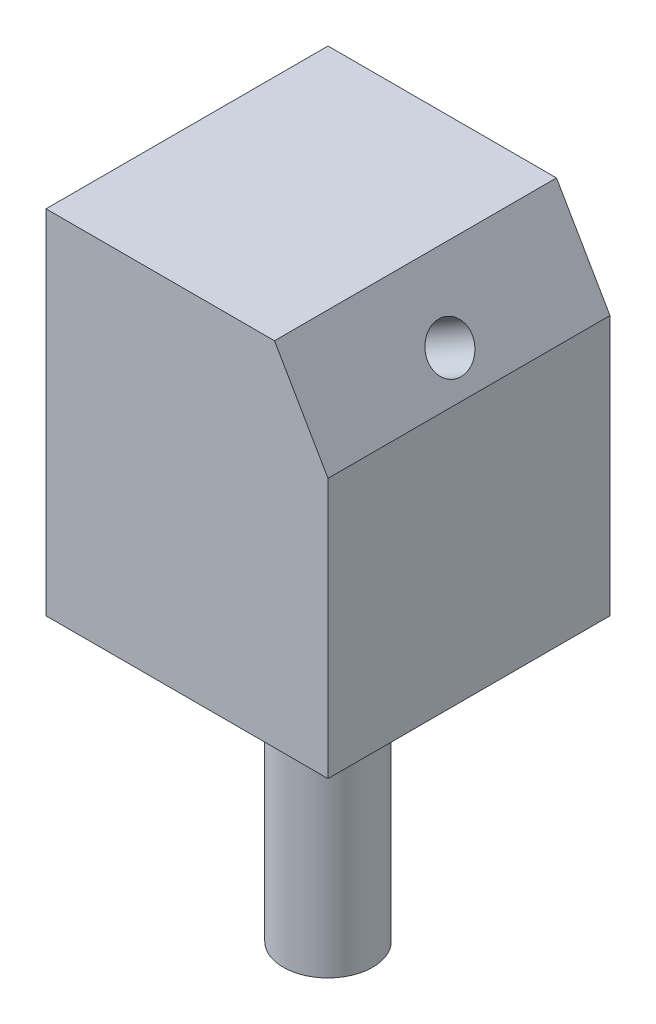
ISO-10303-21;
HEADER;
FILE_DESCRIPTION(('STEP AP214'),'2;1');
FILE_NAME('part.step','',(''),(''),'','','');
FILE_SCHEMA(('AUTOMOTIVE_DESIGN { 1 0 10303 214 1 1 1 1 }'));
ENDSEC;
DATA;
#1=APPLICATION_CONTEXT('core data for automotive mechanical design processes');
#2=APPLICATION_PROTOCOL_DEFINITION('international standard','automotive_design',2000,#1);
#3=PRODUCT_CONTEXT('',#1,'mechanical');
#4=PRODUCT('Part','Part','',(#3));
#5=PRODUCT_RELATED_PRODUCT_CATEGORY('part','',(#4));
#6=PRODUCT_DEFINITION_FORMATION('','',#4);
#7=PRODUCT_DEFINITION_CONTEXT('part definition',#1,'design');
#8=PRODUCT_DEFINITION('design','',#6,#7);
#9=PRODUCT_DEFINITION_SHAPE('','',#8);
#10=(LENGTH_UNIT() NAMED_UNIT(*) SI_UNIT(.MILLI.,.METRE.));
#11=(NAMED_UNIT(*) PLANE_ANGLE_UNIT() SI_UNIT($,.RADIAN.));
#12=(NAMED_UNIT(*) SI_UNIT($,.STERADIAN.) SOLID_ANGLE_UNIT());
#13=UNCERTAINTY_MEASURE_WITH_UNIT(LENGTH_MEASURE(1.E-05),#10,'distance_accuracy_value','');
#14=(GEOMETRIC_REPRESENTATION_CONTEXT(3) GLOBAL_UNCERTAINTY_ASSIGNED_CONTEXT((#13)) GLOBAL_UNIT_ASSIGNED_CONTEXT((#10,
#11,#12)) REPRESENTATION_CONTEXT('',''));
#15=CARTESIAN_POINT('',(0.,0.,0.));
#16=DIRECTION('',(0.,0.,1.));
#17=DIRECTION('',(1.,0.,0.));
#18=AXIS2_PLACEMENT_3D('',#15,#16,#17);
#19=CARTESIAN_POINT('',(13.859649122807,30.,5.70175438596492));
#20=DIRECTION('',(-1.,0.,0.));
#21=DIRECTION('',(0.,0.,1.));
#22=AXIS2_PLACEMENT_3D('',#19,#20,#21);
#23=PLANE('',#22);
#24=DIRECTION('',(0.,-1.,0.));
#25=VECTOR('',#24,1.);
#26=CARTESIAN_POINT('',(13.859649122807,30.,-14.2982456140351));
#27=LINE('',#26,#25);
#28=CARTESIAN_POINT('',(13.859649122807,18.4443493210276,-14.2982456140351));
#29=VERTEX_POINT('',#28);
#30=CARTESIAN_POINT('',(13.859649122807,0.,-14.2982456140351));
#31=VERTEX_POINT('',#30);
#32=EDGE_CURVE('E55',#29,#31,#27,.T.);
#33=ORIENTED_EDGE('',*,*,#32,.F.);
#34=DIRECTION('',(0.,0.,1.));
#35=VECTOR('',#34,1.);
#36=CARTESIAN_POINT('',(13.859649122807,18.4443493210276,-14.2982456140351));
#37=LINE('',#36,#35);
#38=CARTESIAN_POINT('',(13.859649122807,18.4443493210276,5.70175438596492));
#39=VERTEX_POINT('',#38);
#40=EDGE_CURVE('E117',#29,#39,#37,.T.);
#41=ORIENTED_EDGE('',*,*,#40,.T.);
#42=DIRECTION('',(0.,-1.,0.));
#43=VECTOR('',#42,1.);
#44=CARTESIAN_POINT('',(13.859649122807,30.,5.70175438596492));
#45=LINE('',#44,#43);
#46=CARTESIAN_POINT('',(13.859649122807,0.,5.70175438596492));
#47=VERTEX_POINT('',#46);
#48=EDGE_CURVE('E99',#39,#47,#45,.T.);
#49=ORIENTED_EDGE('',*,*,#48,.T.);
#50=DIRECTION('',(0.,0.,-1.));
#51=VECTOR('',#50,1.);
#52=CARTESIAN_POINT('',(13.859649122807,0.,5.70175438596492));
#53=LINE('',#52,#51);
#54=EDGE_CURVE('E101',#47,#31,#53,.T.);
#55=ORIENTED_EDGE('',*,*,#54,.T.);
#56=EDGE_LOOP('',(#33,#41,#49,#55));
#57=FACE_BOUND('',#56,.T.);
#58=ADVANCED_FACE('F32',(#57),#23,.F.);
#59=CARTESIAN_POINT('',(-6.14035087719298,30.,5.70175438596492));
#60=DIRECTION('',(1.,0.,0.));
#61=DIRECTION('',(0.,0.,-1.));
#62=AXIS2_PLACEMENT_3D('',#59,#60,#61);
#63=PLANE('',#62);
#64=CARTESIAN_POINT('',(-6.14035087719298,9.99252381273904,-4.29824561403508));
#65=DIRECTION('',(1.,0.,0.));
#66=DIRECTION('',(0.,1.,0.));
#67=AXIS2_PLACEMENT_3D('',#64,#65,#66);
#68=ELLIPSE('',#67,1.83423392498734,1.5875);
#69=CARTESIAN_POINT('',(-6.14035087719298,11.8267577377264,-4.29824561403508));
#70=VERTEX_POINT('',#69);
#71=EDGE_CURVE('E124',#70,#70,#68,.T.);
#72=ORIENTED_EDGE('',*,*,#71,.T.);
#73=EDGE_LOOP('',(#72));
#74=FACE_BOUND('',#73,.T.);
#75=DIRECTION('',(0.,-1.,0.));
#76=VECTOR('',#75,1.);
#77=CARTESIAN_POINT('',(-6.14035087719298,30.,5.70175438596492));
#78=LINE('',#77,#76);
#79=CARTESIAN_POINT('',(-6.14035087719298,25.,5.70175438596492));
#80=VERTEX_POINT('',#79);
#81=CARTESIAN_POINT('',(-6.14035087719298,0.,5.70175438596492));
#82=VERTEX_POINT('',#81);
#83=EDGE_CURVE('E36',#80,#82,#78,.T.);
#84=ORIENTED_EDGE('',*,*,#83,.F.);
#85=DIRECTION('',(0.,0.,1.));
#86=VECTOR('',#85,1.);
#87=CARTESIAN_POINT('',(-6.14035087719298,25.,-14.2982456140351));
#88=LINE('',#87,#86);
#89=CARTESIAN_POINT('',(-6.14035087719298,25.,-14.2982456140351));
#90=VERTEX_POINT('',#89);
#91=EDGE_CURVE('E86',#90,#80,#88,.T.);
#92=ORIENTED_EDGE('',*,*,#91,.F.);
#93=DIRECTION('',(0.,-1.,0.));
#94=VECTOR('',#93,1.);
#95=CARTESIAN_POINT('',(-6.14035087719298,30.,-14.2982456140351));
#96=LINE('',#95,#94);
#97=CARTESIAN_POINT('',(-6.14035087719298,0.,-14.2982456140351));
#98=VERTEX_POINT('',#97);
#99=EDGE_CURVE('E48',#90,#98,#96,.T.);
#100=ORIENTED_EDGE('',*,*,#99,.T.);
#101=DIRECTION('',(0.,0.,1.));
#102=VECTOR('',#101,1.);
#103=CARTESIAN_POINT('',(-6.14035087719298,0.,5.70175438596492));
#104=LINE('',#103,#102);
#105=EDGE_CURVE('E115',#98,#82,#104,.T.);
#106=ORIENTED_EDGE('',*,*,#105,.T.);
#107=EDGE_LOOP('',(#84,#92,#100,#106));
#108=FACE_BOUND('',#107,.T.);
#109=ADVANCED_FACE('F34',(#74,#108),#63,.F.);
#110=CARTESIAN_POINT('',(-6.14035087719298,30.,5.70175438596492));
#111=DIRECTION('',(0.,0.,-1.));
#112=DIRECTION('',(-1.,0.,0.));
#113=AXIS2_PLACEMENT_3D('',#110,#111,#112);
#114=PLANE('',#113);
#115=DIRECTION('',(0.500936676278387,-0.865483937666762,0.));
#116=VECTOR('',#115,1.);
#117=CARTESIAN_POINT('',(13.859649122807,18.4443493210276,5.70175438596492));
#118=LINE('',#117,#116);
#119=CARTESIAN_POINT('',(10.0652796157082,25.,5.70175438596492));
#120=VERTEX_POINT('',#119);
#121=EDGE_CURVE('E123',#120,#39,#118,.T.);
#122=ORIENTED_EDGE('',*,*,#121,.F.);
#123=DIRECTION('',(1.,0.,0.));
#124=VECTOR('',#123,1.);
#125=CARTESIAN_POINT('',(10.0652796157082,25.,5.70175438596492));
#126=LINE('',#125,#124);
#127=EDGE_CURVE('E90',#80,#120,#126,.T.);
#128=ORIENTED_EDGE('',*,*,#127,.F.);
#129=ORIENTED_EDGE('',*,*,#83,.T.);
#130=DIRECTION('',(1.,0.,0.));
#131=VECTOR('',#130,1.);
#132=CARTESIAN_POINT('',(-6.14035087719298,0.,5.70175438596492));
#133=LINE('',#132,#131);
#134=EDGE_CURVE('E111',#82,#47,#133,.T.);
#135=ORIENTED_EDGE('',*,*,#134,.T.);
#136=ORIENTED_EDGE('',*,*,#48,.F.);
#137=EDGE_LOOP('',(#122,#128,#129,#135,#136));
#138=FACE_BOUND('',#137,.T.);
#139=ADVANCED_FACE('F110',(#138),#114,.F.);
#140=CARTESIAN_POINT('',(-6.14035087719298,30.,-14.2982456140351));
#141=DIRECTION('',(0.,0.,1.));
#142=DIRECTION('',(1.,0.,0.));
#143=AXIS2_PLACEMENT_3D('',#140,#141,#142);
#144=PLANE('',#143);
#145=DIRECTION('',(1.,0.,0.));
#146=VECTOR('',#145,1.);
#147=CARTESIAN_POINT('',(10.0652796157082,25.,-14.2982456140351));
#148=LINE('',#147,#146);
#149=CARTESIAN_POINT('',(10.0652796157082,25.,-14.2982456140351));
#150=VERTEX_POINT('',#149);
#151=EDGE_CURVE('E83',#90,#150,#148,.T.);
#152=ORIENTED_EDGE('',*,*,#151,.T.);
#153=DIRECTION('',(0.500936676278387,-0.865483937666762,0.));
#154=VECTOR('',#153,1.);
#155=CARTESIAN_POINT('',(13.859649122807,18.4443493210276,-14.2982456140351));
#156=LINE('',#155,#154);
#157=EDGE_CURVE('E119',#150,#29,#156,.T.);
#158=ORIENTED_EDGE('',*,*,#157,.T.);
#159=ORIENTED_EDGE('',*,*,#32,.T.);
#160=DIRECTION('',(-1.,0.,0.));
#161=VECTOR('',#160,1.);
#162=CARTESIAN_POINT('',(-6.14035087719298,0.,-14.2982456140351));
#163=LINE('',#162,#161);
#164=EDGE_CURVE('E96',#31,#98,#163,.T.);
#165=ORIENTED_EDGE('',*,*,#164,.T.);
#166=ORIENTED_EDGE('',*,*,#99,.F.);
#167=EDGE_LOOP('',(#152,#158,#159,#165,#166));
#168=FACE_BOUND('',#167,.T.);
#169=ADVANCED_FACE('F94',(#168),#144,.F.);
#170=CARTESIAN_POINT('',(0.,0.,0.));
#171=DIRECTION('',(0.,-1.,0.));
#172=DIRECTION('',(0.,0.,-1.));
#173=AXIS2_PLACEMENT_3D('',#170,#171,#172);
#174=PLANE('',#173);
#175=CARTESIAN_POINT('',(3.85964912280702,0.,-4.29824561403508));
#176=DIRECTION('',(0.,-1.,0.));
#177=DIRECTION('',(0.,0.,-1.));
#178=AXIS2_PLACEMENT_3D('',#175,#176,#177);
#179=CIRCLE('',#178,3.175);
#180=CARTESIAN_POINT('',(3.85964912280702,0.,-7.47324561403508));
#181=VERTEX_POINT('',#180);
#182=EDGE_CURVE('E11',#181,#181,#179,.T.);
#183=ORIENTED_EDGE('',*,*,#182,.F.);
#184=EDGE_LOOP('',(#183));
#185=FACE_BOUND('',#184,.T.);
#186=ORIENTED_EDGE('',*,*,#105,.F.);
#187=ORIENTED_EDGE('',*,*,#164,.F.);
#188=ORIENTED_EDGE('',*,*,#54,.F.);
#189=ORIENTED_EDGE('',*,*,#134,.F.);
#190=EDGE_LOOP('',(#186,#187,#188,#189));
#191=FACE_BOUND('',#190,.T.);
#192=ADVANCED_FACE('F114',(#185,#191),#174,.T.);
#193=CARTESIAN_POINT('',(13.859649122807,18.4443493210276,-14.2982456140351));
#194=DIRECTION('',(-0.865483937666762,-0.500936676278387,0.));
#195=DIRECTION('',(0.500936676278387,-0.865483937666762,0.));
#196=AXIS2_PLACEMENT_3D('',#193,#194,#195);
#197=PLANE('',#196);
#198=CARTESIAN_POINT('',(12.5052093719963,20.7844571717306,-4.29824561403508));
#199=DIRECTION('',(0.865483937666762,0.500936676278387,0.));
#200=DIRECTION('',(-0.500936676278387,0.865483937666762,0.));
#201=AXIS2_PLACEMENT_3D('',#198,#199,#200);
#202=CIRCLE('',#201,1.5875);
#203=CARTESIAN_POINT('',(11.7099723984043,22.1584129227766,-4.29824561403508));
#204=VERTEX_POINT('',#203);
#205=EDGE_CURVE('E132',#204,#204,#202,.T.);
#206=ORIENTED_EDGE('',*,*,#205,.F.);
#207=EDGE_LOOP('',(#206));
#208=FACE_BOUND('',#207,.T.);
#209=ORIENTED_EDGE('',*,*,#40,.F.);
#210=ORIENTED_EDGE('',*,*,#157,.F.);
#211=DIRECTION('',(0.,0.,1.));
#212=VECTOR('',#211,1.);
#213=CARTESIAN_POINT('',(10.0652796157082,25.,-14.2982456140351));
#214=LINE('',#213,#212);
#215=EDGE_CURVE('E89',#150,#120,#214,.T.);
#216=ORIENTED_EDGE('',*,*,#215,.T.);
#217=ORIENTED_EDGE('',*,*,#121,.T.);
#218=EDGE_LOOP('',(#209,#210,#216,#217));
#219=FACE_BOUND('',#218,.T.);
#220=ADVANCED_FACE('F126',(#208,#219),#197,.F.);
#221=CARTESIAN_POINT('',(-13.4593087580066,5.75635688337897,-4.29824561403508));
#222=DIRECTION('',(0.865483937666762,0.500936676278387,0.));
#223=DIRECTION('',(-0.500936676278387,0.865483937666762,0.));
#224=AXIS2_PLACEMENT_3D('',#221,#222,#223);
#225=CYLINDRICAL_SURFACE('',#224,1.5875);
#226=ORIENTED_EDGE('',*,*,#205,.T.);
#227=EDGE_LOOP('',(#226));
#228=FACE_BOUND('',#227,.T.);
#229=ORIENTED_EDGE('',*,*,#71,.F.);
#230=EDGE_LOOP('',(#229));
#231=FACE_BOUND('',#230,.T.);
#232=ADVANCED_FACE('F140',(#228,#231),#225,.F.);
#233=CARTESIAN_POINT('',(3.85964912280702,-20.,-4.29824561403508));
#234=DIRECTION('',(0.,1.,0.));
#235=DIRECTION('',(0.,0.,1.));
#236=AXIS2_PLACEMENT_3D('',#233,#234,#235);
#237=CYLINDRICAL_SURFACE('',#236,3.175);
#238=CARTESIAN_POINT('',(3.85964912280702,-20.,-4.29824561403508));
#239=DIRECTION('',(0.,-1.,0.));
#240=DIRECTION('',(0.,0.,-1.));
#241=AXIS2_PLACEMENT_3D('',#238,#239,#240);
#242=CIRCLE('',#241,3.175);
#243=CARTESIAN_POINT('',(3.85964912280702,-20.,-7.47324561403508));
#244=VERTEX_POINT('',#243);
#245=EDGE_CURVE('E127',#244,#244,#242,.T.);
#246=ORIENTED_EDGE('',*,*,#245,.F.);
#247=EDGE_LOOP('',(#246));
#248=FACE_BOUND('',#247,.T.);
#249=ORIENTED_EDGE('',*,*,#182,.T.);
#250=EDGE_LOOP('',(#249));
#251=FACE_BOUND('',#250,.T.);
#252=ADVANCED_FACE('F142',(#248,#251),#237,.T.);
#253=CARTESIAN_POINT('',(3.85964912280702,-20.,-4.29824561403508));
#254=DIRECTION('',(0.,-1.,0.));
#255=DIRECTION('',(0.,0.,-1.));
#256=AXIS2_PLACEMENT_3D('',#253,#254,#255);
#257=PLANE('',#256);
#258=ORIENTED_EDGE('',*,*,#245,.T.);
#259=EDGE_LOOP('',(#258));
#260=FACE_BOUND('',#259,.T.);
#261=ADVANCED_FACE('F149',(#260),#257,.T.);
#262=CARTESIAN_POINT('',(10.0652796157082,25.,-14.2982456140351));
#263=DIRECTION('',(0.,-1.,0.));
#264=DIRECTION('',(1.,0.,0.));
#265=AXIS2_PLACEMENT_3D('',#262,#263,#264);
#266=PLANE('',#265);
#267=ORIENTED_EDGE('',*,*,#127,.T.);
#268=ORIENTED_EDGE('',*,*,#215,.F.);
#269=ORIENTED_EDGE('',*,*,#151,.F.);
#270=ORIENTED_EDGE('',*,*,#91,.T.);
#271=EDGE_LOOP('',(#267,#268,#269,#270));
#272=FACE_BOUND('',#271,.T.);
#273=ADVANCED_FACE('F85',(#272),#266,.F.);
#274=CLOSED_SHELL('',(#58,#109,#139,#169,#192,#220,#232,#252,#261,#273));
#275=MANIFOLD_SOLID_BREP('B2',#274);
#276=ADVANCED_BREP_SHAPE_REPRESENTATION('',(#18,#275),#14);
#277=SHAPE_DEFINITION_REPRESENTATION(#9,#276);
ENDSEC;
END-ISO-10303-21;
